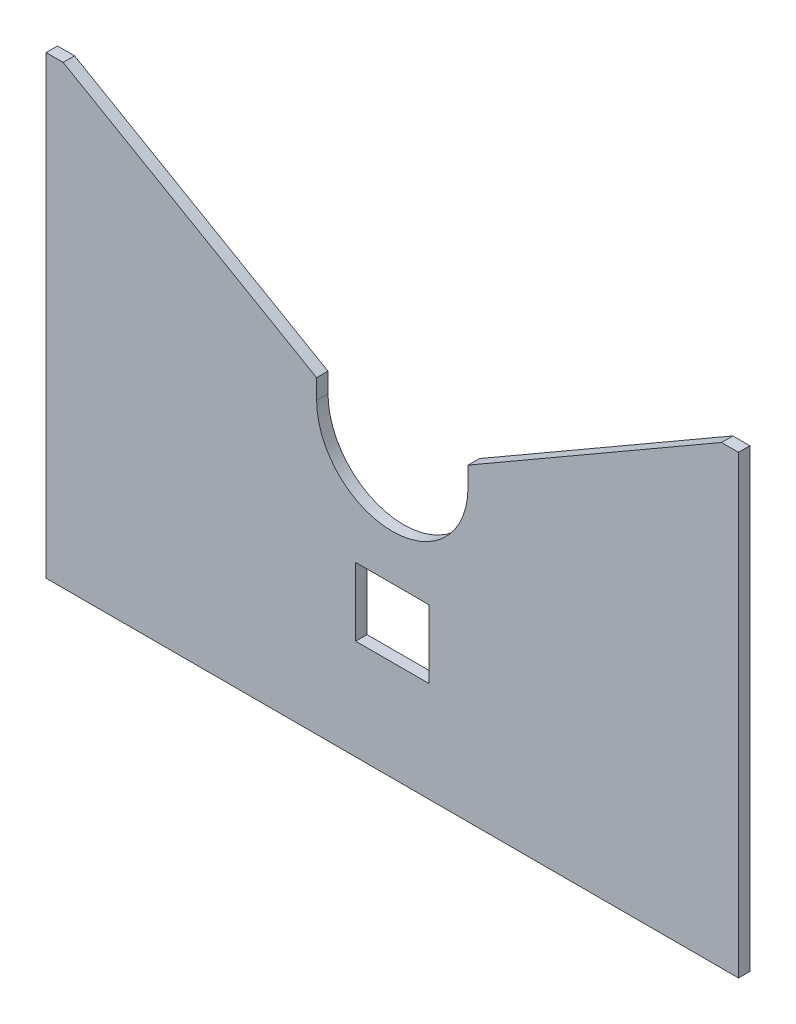
ISO-10303-21;
HEADER;
FILE_DESCRIPTION(('STEP AP214'),'2;1');
FILE_NAME('part.step','',(''),(''),'','','');
FILE_SCHEMA(('AUTOMOTIVE_DESIGN { 1 0 10303 214 1 1 1 1 }'));
ENDSEC;
DATA;
#1=APPLICATION_CONTEXT('core data for automotive mechanical design processes');
#2=APPLICATION_PROTOCOL_DEFINITION('international standard','automotive_design',2000,#1);
#3=PRODUCT_CONTEXT('',#1,'mechanical');
#4=PRODUCT('Part','Part','',(#3));
#5=PRODUCT_RELATED_PRODUCT_CATEGORY('part','',(#4));
#6=PRODUCT_DEFINITION_FORMATION('','',#4);
#7=PRODUCT_DEFINITION_CONTEXT('part definition',#1,'design');
#8=PRODUCT_DEFINITION('design','',#6,#7);
#9=PRODUCT_DEFINITION_SHAPE('','',#8);
#10=(LENGTH_UNIT() NAMED_UNIT(*) SI_UNIT(.MILLI.,.METRE.));
#11=(NAMED_UNIT(*) PLANE_ANGLE_UNIT() SI_UNIT($,.RADIAN.));
#12=(NAMED_UNIT(*) SI_UNIT($,.STERADIAN.) SOLID_ANGLE_UNIT());
#13=UNCERTAINTY_MEASURE_WITH_UNIT(LENGTH_MEASURE(1.E-05),#10,'distance_accuracy_value','');
#14=(GEOMETRIC_REPRESENTATION_CONTEXT(3) GLOBAL_UNCERTAINTY_ASSIGNED_CONTEXT((#13)) GLOBAL_UNIT_ASSIGNED_CONTEXT((#10,
#11,#12)) REPRESENTATION_CONTEXT('',''));
#15=CARTESIAN_POINT('',(0.,0.,0.));
#16=DIRECTION('',(0.,0.,1.));
#17=DIRECTION('',(1.,0.,0.));
#18=AXIS2_PLACEMENT_3D('',#15,#16,#17);
#19=CARTESIAN_POINT('',(760.186616736191,742.397709353845,1069.20385266952));
#20=DIRECTION('',(0.,1.,0.));
#21=DIRECTION('',(-1.,0.,0.));
#22=AXIS2_PLACEMENT_3D('',#19,#20,#21);
#23=PLANE('',#22);
#24=DIRECTION('',(-1.,0.,0.));
#25=VECTOR('',#24,1.);
#26=CARTESIAN_POINT('',(760.186616736191,742.397709353845,1081.90385266952));
#27=LINE('',#26,#25);
#28=CARTESIAN_POINT('',(779.236616736191,742.397709353846,1081.90385266952));
#29=VERTEX_POINT('',#28);
#30=CARTESIAN_POINT('',(760.186616736191,742.397709353845,1081.90385266952));
#31=VERTEX_POINT('',#30);
#32=EDGE_CURVE('E171',#29,#31,#27,.T.);
#33=ORIENTED_EDGE('',*,*,#32,.F.);
#34=DIRECTION('',(0.,0.,1.));
#35=VECTOR('',#34,1.);
#36=CARTESIAN_POINT('',(779.236616736191,742.397709353846,1069.20385266952));
#37=LINE('',#36,#35);
#38=CARTESIAN_POINT('',(779.236616736191,742.397709353846,1069.20385266952));
#39=VERTEX_POINT('',#38);
#40=EDGE_CURVE('E42',#39,#29,#37,.T.);
#41=ORIENTED_EDGE('',*,*,#40,.F.);
#42=DIRECTION('',(-1.,0.,0.));
#43=VECTOR('',#42,1.);
#44=CARTESIAN_POINT('',(760.186616736191,742.397709353845,1069.20385266952));
#45=LINE('',#44,#43);
#46=CARTESIAN_POINT('',(760.186616736191,742.397709353845,1069.20385266952));
#47=VERTEX_POINT('',#46);
#48=EDGE_CURVE('E194',#39,#47,#45,.T.);
#49=ORIENTED_EDGE('',*,*,#48,.T.);
#50=DIRECTION('',(0.,0.,1.));
#51=VECTOR('',#50,1.);
#52=CARTESIAN_POINT('',(760.186616736191,742.397709353845,1069.20385266952));
#53=LINE('',#52,#51);
#54=EDGE_CURVE('E11',#47,#31,#53,.T.);
#55=ORIENTED_EDGE('',*,*,#54,.T.);
#56=EDGE_LOOP('',(#33,#41,#49,#55));
#57=FACE_BOUND('',#56,.T.);
#58=ADVANCED_FACE('F33',(#57),#23,.T.);
#59=CARTESIAN_POINT('',(779.236616736191,742.397709353846,1069.20385266952));
#60=DIRECTION('',(1.,0.,0.));
#61=DIRECTION('',(0.,0.,-1.));
#62=AXIS2_PLACEMENT_3D('',#59,#60,#61);
#63=PLANE('',#62);
#64=DIRECTION('',(0.,1.,0.));
#65=VECTOR('',#64,1.);
#66=CARTESIAN_POINT('',(779.236616736191,742.397709353846,1081.90385266952));
#67=LINE('',#66,#65);
#68=CARTESIAN_POINT('',(779.236616736191,234.397709353846,1081.90385266952));
#69=VERTEX_POINT('',#68);
#70=EDGE_CURVE('E220',#69,#29,#67,.T.);
#71=ORIENTED_EDGE('',*,*,#70,.F.);
#72=DIRECTION('',(0.,0.,1.));
#73=VECTOR('',#72,1.);
#74=CARTESIAN_POINT('',(779.236616736191,234.397709353846,1069.20385266952));
#75=LINE('',#74,#73);
#76=CARTESIAN_POINT('',(779.236616736191,234.397709353846,1069.20385266952));
#77=VERTEX_POINT('',#76);
#78=EDGE_CURVE('E226',#77,#69,#75,.T.);
#79=ORIENTED_EDGE('',*,*,#78,.F.);
#80=DIRECTION('',(0.,1.,0.));
#81=VECTOR('',#80,1.);
#82=CARTESIAN_POINT('',(779.236616736191,742.397709353846,1069.20385266952));
#83=LINE('',#82,#81);
#84=EDGE_CURVE('E191',#77,#39,#83,.T.);
#85=ORIENTED_EDGE('',*,*,#84,.T.);
#86=ORIENTED_EDGE('',*,*,#40,.T.);
#87=EDGE_LOOP('',(#71,#79,#85,#86));
#88=FACE_BOUND('',#87,.T.);
#89=ADVANCED_FACE('F278',(#88),#63,.T.);
#90=CARTESIAN_POINT('',(779.236616736191,234.397709353846,1069.20385266952));
#91=DIRECTION('',(0.,-1.,0.));
#92=DIRECTION('',(1.,0.,0.));
#93=AXIS2_PLACEMENT_3D('',#90,#91,#92);
#94=PLANE('',#93);
#95=DIRECTION('',(1.,0.,0.));
#96=VECTOR('',#95,1.);
#97=CARTESIAN_POINT('',(779.236616736191,234.397709353846,1081.90385266952));
#98=LINE('',#97,#96);
#99=CARTESIAN_POINT('',(6.59338648885022,234.397709353846,1081.90385266952));
#100=VERTEX_POINT('',#99);
#101=EDGE_CURVE('E217',#100,#69,#98,.T.);
#102=ORIENTED_EDGE('',*,*,#101,.F.);
#103=DIRECTION('',(0.,0.,1.));
#104=VECTOR('',#103,1.);
#105=CARTESIAN_POINT('',(6.59338648885022,234.397709353846,1069.20385266952));
#106=LINE('',#105,#104);
#107=CARTESIAN_POINT('',(6.59338648885022,234.397709353846,1069.20385266952));
#108=VERTEX_POINT('',#107);
#109=EDGE_CURVE('E228',#108,#100,#106,.T.);
#110=ORIENTED_EDGE('',*,*,#109,.F.);
#111=DIRECTION('',(1.,0.,0.));
#112=VECTOR('',#111,1.);
#113=CARTESIAN_POINT('',(779.236616736191,234.397709353846,1069.20385266952));
#114=LINE('',#113,#112);
#115=EDGE_CURVE('E188',#108,#77,#114,.T.);
#116=ORIENTED_EDGE('',*,*,#115,.T.);
#117=ORIENTED_EDGE('',*,*,#78,.T.);
#118=EDGE_LOOP('',(#102,#110,#116,#117));
#119=FACE_BOUND('',#118,.T.);
#120=ADVANCED_FACE('F276',(#119),#94,.T.);
#121=CARTESIAN_POINT('',(6.59338648885011,742.397709353846,1069.20385266952));
#122=DIRECTION('',(-1.,0.,0.));
#123=DIRECTION('',(0.,-1.,0.));
#124=AXIS2_PLACEMENT_3D('',#121,#122,#123);
#125=PLANE('',#124);
#126=DIRECTION('',(0.,-1.,0.));
#127=VECTOR('',#126,1.);
#128=CARTESIAN_POINT('',(6.59338648885011,742.397709353846,1081.90385266952));
#129=LINE('',#128,#127);
#130=CARTESIAN_POINT('',(6.59338648885011,742.397709353846,1081.90385266952));
#131=VERTEX_POINT('',#130);
#132=EDGE_CURVE('E214',#131,#100,#129,.T.);
#133=ORIENTED_EDGE('',*,*,#132,.F.);
#134=DIRECTION('',(0.,0.,1.));
#135=VECTOR('',#134,1.);
#136=CARTESIAN_POINT('',(6.59338648885011,742.397709353846,1069.20385266952));
#137=LINE('',#136,#135);
#138=CARTESIAN_POINT('',(6.59338648885011,742.397709353846,1069.20385266952));
#139=VERTEX_POINT('',#138);
#140=EDGE_CURVE('E230',#139,#131,#137,.T.);
#141=ORIENTED_EDGE('',*,*,#140,.F.);
#142=DIRECTION('',(0.,-1.,0.));
#143=VECTOR('',#142,1.);
#144=CARTESIAN_POINT('',(6.59338648885011,742.397709353846,1069.20385266952));
#145=LINE('',#144,#143);
#146=EDGE_CURVE('E185',#139,#108,#145,.T.);
#147=ORIENTED_EDGE('',*,*,#146,.T.);
#148=ORIENTED_EDGE('',*,*,#109,.T.);
#149=EDGE_LOOP('',(#133,#141,#147,#148));
#150=FACE_BOUND('',#149,.T.);
#151=ADVANCED_FACE('F274',(#150),#125,.T.);
#152=CARTESIAN_POINT('',(25.6433864888501,742.397709353845,1069.20385266952));
#153=DIRECTION('',(0.,1.,0.));
#154=DIRECTION('',(-1.,0.,0.));
#155=AXIS2_PLACEMENT_3D('',#152,#153,#154);
#156=PLANE('',#155);
#157=DIRECTION('',(-1.,0.,0.));
#158=VECTOR('',#157,1.);
#159=CARTESIAN_POINT('',(25.6433864888501,742.397709353845,1081.90385266952));
#160=LINE('',#159,#158);
#161=CARTESIAN_POINT('',(25.6433864888501,742.397709353845,1081.90385266952));
#162=VERTEX_POINT('',#161);
#163=EDGE_CURVE('E211',#162,#131,#160,.T.);
#164=ORIENTED_EDGE('',*,*,#163,.F.);
#165=DIRECTION('',(0.,0.,1.));
#166=VECTOR('',#165,1.);
#167=CARTESIAN_POINT('',(25.6433864888501,742.397709353845,1069.20385266952));
#168=LINE('',#167,#166);
#169=CARTESIAN_POINT('',(25.6433864888501,742.397709353845,1069.20385266952));
#170=VERTEX_POINT('',#169);
#171=EDGE_CURVE('E232',#170,#162,#168,.T.);
#172=ORIENTED_EDGE('',*,*,#171,.F.);
#173=DIRECTION('',(-1.,0.,0.));
#174=VECTOR('',#173,1.);
#175=CARTESIAN_POINT('',(25.6433864888501,742.397709353845,1069.20385266952));
#176=LINE('',#175,#174);
#177=EDGE_CURVE('E182',#170,#139,#176,.T.);
#178=ORIENTED_EDGE('',*,*,#177,.T.);
#179=ORIENTED_EDGE('',*,*,#140,.T.);
#180=EDGE_LOOP('',(#164,#172,#178,#179));
#181=FACE_BOUND('',#180,.T.);
#182=ADVANCED_FACE('F270',(#181),#156,.T.);
#183=CARTESIAN_POINT('',(42.1411704309437,732.872709353845,1069.20385266952));
#184=DIRECTION('',(0.5,0.866025403784438,0.));
#185=DIRECTION('',(-0.866025403784439,0.5,0.));
#186=AXIS2_PLACEMENT_3D('',#183,#184,#185);
#187=PLANE('',#186);
#188=DIRECTION('',(-0.866025403784438,0.5,0.));
#189=VECTOR('',#188,1.);
#190=CARTESIAN_POINT('',(42.1411704309437,732.872709353845,1081.90385266952));
#191=LINE('',#190,#189);
#192=CARTESIAN_POINT('',(308.46000161252,579.113460480896,1081.90385266952));
#193=VERTEX_POINT('',#192);
#194=EDGE_CURVE('E208',#193,#162,#191,.T.);
#195=ORIENTED_EDGE('',*,*,#194,.F.);
#196=DIRECTION('',(0.,0.,1.));
#197=VECTOR('',#196,1.);
#198=CARTESIAN_POINT('',(308.46000161252,579.113460480896,1069.20385266952));
#199=LINE('',#198,#197);
#200=CARTESIAN_POINT('',(308.46000161252,579.113460480896,1069.20385266952));
#201=VERTEX_POINT('',#200);
#202=EDGE_CURVE('E234',#201,#193,#199,.T.);
#203=ORIENTED_EDGE('',*,*,#202,.F.);
#204=DIRECTION('',(-0.866025403784438,0.5,0.));
#205=VECTOR('',#204,1.);
#206=CARTESIAN_POINT('',(308.46000161252,579.113460480896,1069.20385266952));
#207=LINE('',#206,#205);
#208=EDGE_CURVE('E180',#201,#170,#207,.T.);
#209=ORIENTED_EDGE('',*,*,#208,.T.);
#210=ORIENTED_EDGE('',*,*,#171,.T.);
#211=EDGE_LOOP('',(#195,#203,#209,#210));
#212=FACE_BOUND('',#211,.T.);
#213=ADVANCED_FACE('F263',(#212),#187,.T.);
#214=CARTESIAN_POINT('',(308.46000161252,557.307056283656,1069.20385266952));
#215=DIRECTION('',(1.,0.,0.));
#216=DIRECTION('',(0.,0.,-1.));
#217=AXIS2_PLACEMENT_3D('',#214,#215,#216);
#218=PLANE('',#217);
#219=DIRECTION('',(0.,1.,0.));
#220=VECTOR('',#219,1.);
#221=CARTESIAN_POINT('',(308.46000161252,557.307056283656,1081.90385266952));
#222=LINE('',#221,#220);
#223=CARTESIAN_POINT('',(308.46000161252,557.307056283656,1081.90385266952));
#224=VERTEX_POINT('',#223);
#225=EDGE_CURVE('E205',#224,#193,#222,.T.);
#226=ORIENTED_EDGE('',*,*,#225,.F.);
#227=DIRECTION('',(0.,0.,1.));
#228=VECTOR('',#227,1.);
#229=CARTESIAN_POINT('',(308.46000161252,557.307056283656,1069.20385266952));
#230=LINE('',#229,#228);
#231=CARTESIAN_POINT('',(308.46000161252,557.307056283656,1069.20385266952));
#232=VERTEX_POINT('',#231);
#233=EDGE_CURVE('E237',#232,#224,#230,.T.);
#234=ORIENTED_EDGE('',*,*,#233,.F.);
#235=DIRECTION('',(0.,1.,0.));
#236=VECTOR('',#235,1.);
#237=CARTESIAN_POINT('',(308.46000161252,557.307056283656,1069.20385266952));
#238=LINE('',#237,#236);
#239=EDGE_CURVE('E177',#232,#201,#238,.T.);
#240=ORIENTED_EDGE('',*,*,#239,.T.);
#241=ORIENTED_EDGE('',*,*,#202,.T.);
#242=EDGE_LOOP('',(#226,#234,#240,#241));
#243=FACE_BOUND('',#242,.T.);
#244=ADVANCED_FACE('F261',(#243),#218,.T.);
#245=CARTESIAN_POINT('',(392.91500161252,557.307056283656,1069.20385266952));
#246=DIRECTION('',(0.,0.,1.));
#247=DIRECTION('',(1.,0.,0.));
#248=AXIS2_PLACEMENT_3D('',#245,#246,#247);
#249=CYLINDRICAL_SURFACE('',#248,84.455);
#250=CARTESIAN_POINT('',(392.91500161252,557.307056283656,1081.90385266952));
#251=DIRECTION('',(0.,0.,-1.));
#252=DIRECTION('',(-1.,0.,0.));
#253=AXIS2_PLACEMENT_3D('',#250,#251,#252);
#254=CIRCLE('',#253,84.455);
#255=CARTESIAN_POINT('',(477.37000161252,557.307056283656,1081.90385266952));
#256=VERTEX_POINT('',#255);
#257=EDGE_CURVE('E202',#256,#224,#254,.T.);
#258=ORIENTED_EDGE('',*,*,#257,.F.);
#259=DIRECTION('',(0.,0.,1.));
#260=VECTOR('',#259,1.);
#261=CARTESIAN_POINT('',(477.37000161252,557.307056283656,1069.20385266952));
#262=LINE('',#261,#260);
#263=CARTESIAN_POINT('',(477.37000161252,557.307056283656,1069.20385266952));
#264=VERTEX_POINT('',#263);
#265=EDGE_CURVE('E238',#264,#256,#262,.T.);
#266=ORIENTED_EDGE('',*,*,#265,.F.);
#267=CARTESIAN_POINT('',(392.91500161252,557.307056283656,1069.20385266952));
#268=DIRECTION('',(0.,0.,-1.));
#269=DIRECTION('',(-1.,0.,0.));
#270=AXIS2_PLACEMENT_3D('',#267,#268,#269);
#271=CIRCLE('',#270,84.455);
#272=EDGE_CURVE('E174',#264,#232,#271,.T.);
#273=ORIENTED_EDGE('',*,*,#272,.T.);
#274=ORIENTED_EDGE('',*,*,#233,.T.);
#275=EDGE_LOOP('',(#258,#266,#273,#274));
#276=FACE_BOUND('',#275,.T.);
#277=ADVANCED_FACE('F258',(#276),#249,.F.);
#278=CARTESIAN_POINT('',(477.37000161252,557.307056283656,1069.20385266952));
#279=DIRECTION('',(-1.,0.,0.));
#280=DIRECTION('',(0.,0.,1.));
#281=AXIS2_PLACEMENT_3D('',#278,#279,#280);
#282=PLANE('',#281);
#283=DIRECTION('',(0.,-1.,0.));
#284=VECTOR('',#283,1.);
#285=CARTESIAN_POINT('',(477.37000161252,557.307056283656,1081.90385266952));
#286=LINE('',#285,#284);
#287=CARTESIAN_POINT('',(477.37000161252,579.113460480892,1081.90385266952));
#288=VERTEX_POINT('',#287);
#289=EDGE_CURVE('E199',#288,#256,#286,.T.);
#290=ORIENTED_EDGE('',*,*,#289,.F.);
#291=DIRECTION('',(0.,0.,1.));
#292=VECTOR('',#291,1.);
#293=CARTESIAN_POINT('',(477.37000161252,579.113460480892,1069.20385266952));
#294=LINE('',#293,#292);
#295=CARTESIAN_POINT('',(477.37000161252,579.113460480892,1069.20385266952));
#296=VERTEX_POINT('',#295);
#297=EDGE_CURVE('E37',#296,#288,#294,.T.);
#298=ORIENTED_EDGE('',*,*,#297,.F.);
#299=DIRECTION('',(0.,-1.,0.));
#300=VECTOR('',#299,1.);
#301=CARTESIAN_POINT('',(477.37000161252,557.307056283656,1069.20385266952));
#302=LINE('',#301,#300);
#303=EDGE_CURVE('E170',#296,#264,#302,.T.);
#304=ORIENTED_EDGE('',*,*,#303,.T.);
#305=ORIENTED_EDGE('',*,*,#265,.T.);
#306=EDGE_LOOP('',(#290,#298,#304,#305));
#307=FACE_BOUND('',#306,.T.);
#308=ADVANCED_FACE('F246',(#307),#282,.T.);
#309=CARTESIAN_POINT('',(477.37000161252,579.113460480892,1069.20385266952));
#310=DIRECTION('',(-0.500000000000009,0.866025403784433,0.));
#311=DIRECTION('',(-0.866025403784433,-0.500000000000009,0.));
#312=AXIS2_PLACEMENT_3D('',#309,#310,#311);
#313=PLANE('',#312);
#314=DIRECTION('',(-0.866025403784433,-0.500000000000009,0.));
#315=VECTOR('',#314,1.);
#316=CARTESIAN_POINT('',(477.37000161252,579.113460480892,1081.90385266952));
#317=LINE('',#316,#315);
#318=EDGE_CURVE('E166',#31,#288,#317,.T.);
#319=ORIENTED_EDGE('',*,*,#318,.F.);
#320=ORIENTED_EDGE('',*,*,#54,.F.);
#321=DIRECTION('',(-0.866025403784438,-0.5,0.));
#322=VECTOR('',#321,1.);
#323=CARTESIAN_POINT('',(743.688832794097,732.872709353845,1069.20385266952));
#324=LINE('',#323,#322);
#325=EDGE_CURVE('E168',#47,#296,#324,.T.);
#326=ORIENTED_EDGE('',*,*,#325,.T.);
#327=ORIENTED_EDGE('',*,*,#297,.T.);
#328=EDGE_LOOP('',(#319,#320,#326,#327));
#329=FACE_BOUND('',#328,.T.);
#330=ADVANCED_FACE('F35',(#329),#313,.T.);
#331=CARTESIAN_POINT('',(392.91500161252,557.307056283656,1069.20385266952));
#332=DIRECTION('',(0.,0.,-1.));
#333=DIRECTION('',(-1.,0.,0.));
#334=AXIS2_PLACEMENT_3D('',#331,#332,#333);
#335=PLANE('',#334);
#336=DIRECTION('',(0.,1.,0.));
#337=VECTOR('',#336,1.);
#338=CARTESIAN_POINT('',(352.006494326527,346.273856864666,1069.20385266952));
#339=LINE('',#338,#337);
#340=CARTESIAN_POINT('',(352.006494326527,346.273856864666,1069.20385266952));
#341=VERTEX_POINT('',#340);
#342=CARTESIAN_POINT('',(352.006494326527,422.394234923687,1069.20385266952));
#343=VERTEX_POINT('',#342);
#344=EDGE_CURVE('E50',#341,#343,#339,.T.);
#345=ORIENTED_EDGE('',*,*,#344,.F.);
#346=DIRECTION('',(-1.,0.,0.));
#347=VECTOR('',#346,1.);
#348=CARTESIAN_POINT('',(433.823508898514,346.273856864666,1069.20385266952));
#349=LINE('',#348,#347);
#350=CARTESIAN_POINT('',(433.823508898514,346.273856864666,1069.20385266952));
#351=VERTEX_POINT('',#350);
#352=EDGE_CURVE('E155',#351,#341,#349,.T.);
#353=ORIENTED_EDGE('',*,*,#352,.F.);
#354=DIRECTION('',(0.,-1.,0.));
#355=VECTOR('',#354,1.);
#356=CARTESIAN_POINT('',(433.823508898514,346.273856864666,1069.20385266952));
#357=LINE('',#356,#355);
#358=CARTESIAN_POINT('',(433.823508898514,422.394234923687,1069.20385266952));
#359=VERTEX_POINT('',#358);
#360=EDGE_CURVE('E139',#359,#351,#357,.T.);
#361=ORIENTED_EDGE('',*,*,#360,.F.);
#362=DIRECTION('',(1.,0.,0.));
#363=VECTOR('',#362,1.);
#364=CARTESIAN_POINT('',(433.823508898514,422.394234923687,1069.20385266952));
#365=LINE('',#364,#363);
#366=EDGE_CURVE('E148',#343,#359,#365,.T.);
#367=ORIENTED_EDGE('',*,*,#366,.F.);
#368=EDGE_LOOP('',(#345,#353,#361,#367));
#369=FACE_BOUND('',#368,.T.);
#370=ORIENTED_EDGE('',*,*,#325,.F.);
#371=ORIENTED_EDGE('',*,*,#48,.F.);
#372=ORIENTED_EDGE('',*,*,#84,.F.);
#373=ORIENTED_EDGE('',*,*,#115,.F.);
#374=ORIENTED_EDGE('',*,*,#146,.F.);
#375=ORIENTED_EDGE('',*,*,#177,.F.);
#376=ORIENTED_EDGE('',*,*,#208,.F.);
#377=ORIENTED_EDGE('',*,*,#239,.F.);
#378=ORIENTED_EDGE('',*,*,#272,.F.);
#379=ORIENTED_EDGE('',*,*,#303,.F.);
#380=EDGE_LOOP('',(#370,#371,#372,#373,#374,#375,#376,#377,#378,#379));
#381=FACE_BOUND('',#380,.T.);
#382=ADVANCED_FACE('F152',(#369,#381),#335,.T.);
#383=CARTESIAN_POINT('',(392.91500161252,557.307056283656,1081.90385266952));
#384=DIRECTION('',(0.,0.,-1.));
#385=DIRECTION('',(-1.,0.,0.));
#386=AXIS2_PLACEMENT_3D('',#383,#384,#385);
#387=PLANE('',#386);
#388=DIRECTION('',(1.,0.,0.));
#389=VECTOR('',#388,1.);
#390=CARTESIAN_POINT('',(433.823508898514,346.273856864666,1081.90385266952));
#391=LINE('',#390,#389);
#392=CARTESIAN_POINT('',(352.006494326527,346.273856864666,1081.90385266952));
#393=VERTEX_POINT('',#392);
#394=CARTESIAN_POINT('',(433.823508898514,346.273856864666,1081.90385266952));
#395=VERTEX_POINT('',#394);
#396=EDGE_CURVE('E325',#393,#395,#391,.T.);
#397=ORIENTED_EDGE('',*,*,#396,.F.);
#398=DIRECTION('',(0.,-1.,0.));
#399=VECTOR('',#398,1.);
#400=CARTESIAN_POINT('',(352.006494326527,346.273856864666,1081.90385266952));
#401=LINE('',#400,#399);
#402=CARTESIAN_POINT('',(352.006494326527,422.394234923687,1081.90385266952));
#403=VERTEX_POINT('',#402);
#404=EDGE_CURVE('E167',#403,#393,#401,.T.);
#405=ORIENTED_EDGE('',*,*,#404,.F.);
#406=DIRECTION('',(-1.,0.,0.));
#407=VECTOR('',#406,1.);
#408=CARTESIAN_POINT('',(433.823508898514,422.394234923687,1081.90385266952));
#409=LINE('',#408,#407);
#410=CARTESIAN_POINT('',(433.823508898514,422.394234923687,1081.90385266952));
#411=VERTEX_POINT('',#410);
#412=EDGE_CURVE('E164',#411,#403,#409,.T.);
#413=ORIENTED_EDGE('',*,*,#412,.F.);
#414=DIRECTION('',(0.,1.,0.));
#415=VECTOR('',#414,1.);
#416=CARTESIAN_POINT('',(433.823508898514,346.273856864666,1081.90385266952));
#417=LINE('',#416,#415);
#418=EDGE_CURVE('E142',#395,#411,#417,.T.);
#419=ORIENTED_EDGE('',*,*,#418,.F.);
#420=EDGE_LOOP('',(#397,#405,#413,#419));
#421=FACE_BOUND('',#420,.T.);
#422=ORIENTED_EDGE('',*,*,#32,.T.);
#423=ORIENTED_EDGE('',*,*,#318,.T.);
#424=ORIENTED_EDGE('',*,*,#289,.T.);
#425=ORIENTED_EDGE('',*,*,#257,.T.);
#426=ORIENTED_EDGE('',*,*,#225,.T.);
#427=ORIENTED_EDGE('',*,*,#194,.T.);
#428=ORIENTED_EDGE('',*,*,#163,.T.);
#429=ORIENTED_EDGE('',*,*,#132,.T.);
#430=ORIENTED_EDGE('',*,*,#101,.T.);
#431=ORIENTED_EDGE('',*,*,#70,.T.);
#432=EDGE_LOOP('',(#422,#423,#424,#425,#426,#427,#428,#429,#430,#431));
#433=FACE_BOUND('',#432,.T.);
#434=ADVANCED_FACE('F248',(#421,#433),#387,.F.);
#435=CARTESIAN_POINT('',(352.006494326527,346.273856864666,1193.65507561281));
#436=DIRECTION('',(-1.,0.,0.));
#437=DIRECTION('',(0.,0.,1.));
#438=AXIS2_PLACEMENT_3D('',#435,#436,#437);
#439=PLANE('',#438);
#440=ORIENTED_EDGE('',*,*,#404,.T.);
#441=DIRECTION('',(0.,0.,-1.));
#442=VECTOR('',#441,1.);
#443=CARTESIAN_POINT('',(352.006494326527,346.273856864666,1193.65507561281));
#444=LINE('',#443,#442);
#445=EDGE_CURVE('E160',#393,#341,#444,.T.);
#446=ORIENTED_EDGE('',*,*,#445,.T.);
#447=ORIENTED_EDGE('',*,*,#344,.T.);
#448=DIRECTION('',(0.,0.,-1.));
#449=VECTOR('',#448,1.);
#450=CARTESIAN_POINT('',(352.006494326527,422.394234923687,1193.65507561281));
#451=LINE('',#450,#449);
#452=EDGE_CURVE('E145',#403,#343,#451,.T.);
#453=ORIENTED_EDGE('',*,*,#452,.F.);
#454=EDGE_LOOP('',(#440,#446,#447,#453));
#455=FACE_BOUND('',#454,.T.);
#456=ADVANCED_FACE('F309',(#455),#439,.F.);
#457=CARTESIAN_POINT('',(433.823508898514,346.273856864666,1193.65507561281));
#458=DIRECTION('',(0.,-1.,0.));
#459=DIRECTION('',(0.,0.,-1.));
#460=AXIS2_PLACEMENT_3D('',#457,#458,#459);
#461=PLANE('',#460);
#462=ORIENTED_EDGE('',*,*,#396,.T.);
#463=DIRECTION('',(0.,0.,-1.));
#464=VECTOR('',#463,1.);
#465=CARTESIAN_POINT('',(433.823508898514,346.273856864666,1193.65507561281));
#466=LINE('',#465,#464);
#467=EDGE_CURVE('E144',#395,#351,#466,.T.);
#468=ORIENTED_EDGE('',*,*,#467,.T.);
#469=ORIENTED_EDGE('',*,*,#352,.T.);
#470=ORIENTED_EDGE('',*,*,#445,.F.);
#471=EDGE_LOOP('',(#462,#468,#469,#470));
#472=FACE_BOUND('',#471,.T.);
#473=ADVANCED_FACE('F314',(#472),#461,.F.);
#474=CARTESIAN_POINT('',(433.823508898514,346.273856864666,1193.65507561281));
#475=DIRECTION('',(1.,0.,0.));
#476=DIRECTION('',(0.,0.,-1.));
#477=AXIS2_PLACEMENT_3D('',#474,#475,#476);
#478=PLANE('',#477);
#479=ORIENTED_EDGE('',*,*,#418,.T.);
#480=DIRECTION('',(0.,0.,-1.));
#481=VECTOR('',#480,1.);
#482=CARTESIAN_POINT('',(433.823508898514,422.394234923687,1193.65507561281));
#483=LINE('',#482,#481);
#484=EDGE_CURVE('E58',#411,#359,#483,.T.);
#485=ORIENTED_EDGE('',*,*,#484,.T.);
#486=ORIENTED_EDGE('',*,*,#360,.T.);
#487=ORIENTED_EDGE('',*,*,#467,.F.);
#488=EDGE_LOOP('',(#479,#485,#486,#487));
#489=FACE_BOUND('',#488,.T.);
#490=ADVANCED_FACE('F136',(#489),#478,.F.);
#491=CARTESIAN_POINT('',(433.823508898514,422.394234923687,1193.65507561281));
#492=DIRECTION('',(0.,1.,0.));
#493=DIRECTION('',(0.,0.,1.));
#494=AXIS2_PLACEMENT_3D('',#491,#492,#493);
#495=PLANE('',#494);
#496=ORIENTED_EDGE('',*,*,#412,.T.);
#497=ORIENTED_EDGE('',*,*,#452,.T.);
#498=ORIENTED_EDGE('',*,*,#366,.T.);
#499=ORIENTED_EDGE('',*,*,#484,.F.);
#500=EDGE_LOOP('',(#496,#497,#498,#499));
#501=FACE_BOUND('',#500,.T.);
#502=ADVANCED_FACE('F149',(#501),#495,.F.);
#503=CLOSED_SHELL('',(#58,#89,#120,#151,#182,#213,#244,#277,#308,#330,#382,#434,#456,#473,#490,#502));
#504=MANIFOLD_SOLID_BREP('B2',#503);
#505=ADVANCED_BREP_SHAPE_REPRESENTATION('',(#18,#504),#14);
#506=SHAPE_DEFINITION_REPRESENTATION(#9,#505);
ENDSEC;
END-ISO-10303-21;
